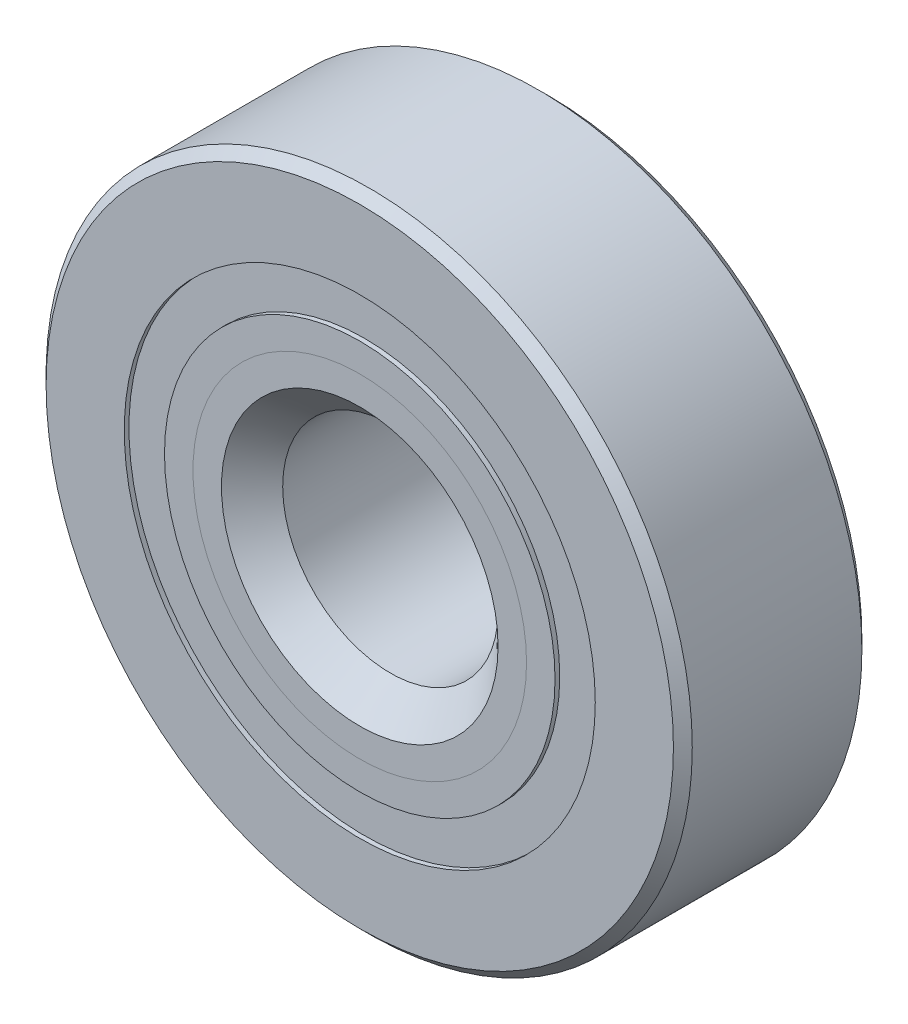
ISO-10303-21;
HEADER;
FILE_DESCRIPTION(('STEP AP214'),'2;1');
FILE_NAME('part.step','',(''),(''),'','','');
FILE_SCHEMA(('AUTOMOTIVE_DESIGN { 1 0 10303 214 1 1 1 1 }'));
ENDSEC;
DATA;
#1=APPLICATION_CONTEXT('core data for automotive mechanical design processes');
#2=APPLICATION_PROTOCOL_DEFINITION('international standard','automotive_design',2000,#1);
#3=PRODUCT_CONTEXT('',#1,'mechanical');
#4=PRODUCT('Part','Part','',(#3));
#5=PRODUCT_RELATED_PRODUCT_CATEGORY('part','',(#4));
#6=PRODUCT_DEFINITION_FORMATION('','',#4);
#7=PRODUCT_DEFINITION_CONTEXT('part definition',#1,'design');
#8=PRODUCT_DEFINITION('design','',#6,#7);
#9=PRODUCT_DEFINITION_SHAPE('','',#8);
#10=(LENGTH_UNIT() NAMED_UNIT(*) SI_UNIT(.MILLI.,.METRE.));
#11=(NAMED_UNIT(*) PLANE_ANGLE_UNIT() SI_UNIT($,.RADIAN.));
#12=(NAMED_UNIT(*) SI_UNIT($,.STERADIAN.) SOLID_ANGLE_UNIT());
#13=UNCERTAINTY_MEASURE_WITH_UNIT(LENGTH_MEASURE(1.E-05),#10,'distance_accuracy_value','');
#14=(GEOMETRIC_REPRESENTATION_CONTEXT(3) GLOBAL_UNCERTAINTY_ASSIGNED_CONTEXT((#13)) GLOBAL_UNIT_ASSIGNED_CONTEXT((#10,
#11,#12)) REPRESENTATION_CONTEXT('',''));
#15=CARTESIAN_POINT('',(0.,0.,0.));
#16=DIRECTION('',(0.,0.,1.));
#17=DIRECTION('',(1.,0.,0.));
#18=AXIS2_PLACEMENT_3D('',#15,#16,#17);
#19=CARTESIAN_POINT('',(0.,6.94313186813187,-1.3697972036192));
#20=DIRECTION('',(0.,0.,-1.));
#21=DIRECTION('',(-1.,0.,0.));
#22=AXIS2_PLACEMENT_3D('',#19,#20,#21);
#23=PLANE('',#22);
#24=CARTESIAN_POINT('',(0.,0.,-1.3697972036192));
#25=DIRECTION('',(0.,0.,1.));
#26=DIRECTION('',(1.,0.,0.));
#27=AXIS2_PLACEMENT_3D('',#24,#25,#26);
#28=CIRCLE('',#27,5.75686813186813);
#29=CARTESIAN_POINT('',(5.75686813186813,0.,-1.3697972036192));
#30=VERTEX_POINT('',#29);
#31=EDGE_CURVE('E11',#30,#30,#28,.T.);
#32=ORIENTED_EDGE('',*,*,#31,.F.);
#33=EDGE_LOOP('',(#32));
#34=FACE_BOUND('',#33,.T.);
#35=CARTESIAN_POINT('',(0.,0.,-1.3697972036192));
#36=DIRECTION('',(0.,0.,1.));
#37=DIRECTION('',(1.,0.,0.));
#38=AXIS2_PLACEMENT_3D('',#35,#36,#37);
#39=CIRCLE('',#38,6.94313186813187);
#40=CARTESIAN_POINT('',(6.94313186813187,0.,-1.3697972036192));
#41=VERTEX_POINT('',#40);
#42=EDGE_CURVE('E58',#41,#41,#39,.T.);
#43=ORIENTED_EDGE('',*,*,#42,.T.);
#44=EDGE_LOOP('',(#43));
#45=FACE_BOUND('',#44,.T.);
#46=ADVANCED_FACE('F44',(#34,#45),#23,.F.);
#47=CARTESIAN_POINT('',(0.,0.,2.778125));
#48=DIRECTION('',(0.,0.,1.));
#49=DIRECTION('',(1.,0.,0.));
#50=AXIS2_PLACEMENT_3D('',#47,#48,#49);
#51=CYLINDRICAL_SURFACE('',#50,5.75686813186813);
#52=CARTESIAN_POINT('',(0.,0.,-2.63921875));
#53=DIRECTION('',(0.,0.,1.));
#54=DIRECTION('',(1.,0.,0.));
#55=AXIS2_PLACEMENT_3D('',#52,#53,#54);
#56=CIRCLE('',#55,5.75686813186813);
#57=CARTESIAN_POINT('',(5.75686813186813,0.,-2.63921875));
#58=VERTEX_POINT('',#57);
#59=EDGE_CURVE('E50',#58,#58,#56,.T.);
#60=ORIENTED_EDGE('',*,*,#59,.F.);
#61=EDGE_LOOP('',(#60));
#62=FACE_BOUND('',#61,.T.);
#63=ORIENTED_EDGE('',*,*,#31,.T.);
#64=EDGE_LOOP('',(#63));
#65=FACE_BOUND('',#64,.T.);
#66=ADVANCED_FACE('F73',(#62,#65),#51,.F.);
#67=CARTESIAN_POINT('',(0.,6.94313186813187,-2.63921875));
#68=DIRECTION('',(0.,0.,1.));
#69=DIRECTION('',(1.,0.,0.));
#70=AXIS2_PLACEMENT_3D('',#67,#68,#69);
#71=PLANE('',#70);
#72=CARTESIAN_POINT('',(0.,0.,-2.63921875));
#73=DIRECTION('',(0.,0.,1.));
#74=DIRECTION('',(1.,0.,0.));
#75=AXIS2_PLACEMENT_3D('',#72,#73,#74);
#76=CIRCLE('',#75,6.94313186813187);
#77=CARTESIAN_POINT('',(6.94313186813187,0.,-2.63921875));
#78=VERTEX_POINT('',#77);
#79=EDGE_CURVE('E54',#78,#78,#76,.T.);
#80=ORIENTED_EDGE('',*,*,#79,.F.);
#81=EDGE_LOOP('',(#80));
#82=FACE_BOUND('',#81,.T.);
#83=ORIENTED_EDGE('',*,*,#59,.T.);
#84=EDGE_LOOP('',(#83));
#85=FACE_BOUND('',#84,.T.);
#86=ADVANCED_FACE('F68',(#82,#85),#71,.F.);
#87=CARTESIAN_POINT('',(0.,0.,2.778125));
#88=DIRECTION('',(0.,0.,1.));
#89=DIRECTION('',(1.,0.,0.));
#90=AXIS2_PLACEMENT_3D('',#87,#88,#89);
#91=CYLINDRICAL_SURFACE('',#90,6.94313186813187);
#92=ORIENTED_EDGE('',*,*,#42,.F.);
#93=EDGE_LOOP('',(#92));
#94=FACE_BOUND('',#93,.T.);
#95=ORIENTED_EDGE('',*,*,#79,.T.);
#96=EDGE_LOOP('',(#95));
#97=FACE_BOUND('',#96,.T.);
#98=ADVANCED_FACE('F65',(#94,#97),#91,.T.);
#99=CLOSED_SHELL('',(#46,#66,#86,#98));
#100=MANIFOLD_SOLID_BREP('B2',#99);
#101=CARTESIAN_POINT('',(0.,6.94313186813187,2.63921875));
#102=DIRECTION('',(0.,0.,-1.));
#103=DIRECTION('',(-1.,0.,0.));
#104=AXIS2_PLACEMENT_3D('',#101,#102,#103);
#105=PLANE('',#104);
#106=CARTESIAN_POINT('',(0.,0.,2.63921875));
#107=DIRECTION('',(0.,0.,1.));
#108=DIRECTION('',(1.,0.,0.));
#109=AXIS2_PLACEMENT_3D('',#106,#107,#108);
#110=CIRCLE('',#109,5.75686813186813);
#111=CARTESIAN_POINT('',(5.75686813186813,0.,2.63921875));
#112=VERTEX_POINT('',#111);
#113=EDGE_CURVE('E43',#112,#112,#110,.T.);
#114=ORIENTED_EDGE('',*,*,#113,.F.);
#115=EDGE_LOOP('',(#114));
#116=FACE_BOUND('',#115,.T.);
#117=CARTESIAN_POINT('',(0.,0.,2.63921875));
#118=DIRECTION('',(0.,0.,1.));
#119=DIRECTION('',(1.,0.,0.));
#120=AXIS2_PLACEMENT_3D('',#117,#118,#119);
#121=CIRCLE('',#120,6.94313186813187);
#122=CARTESIAN_POINT('',(6.94313186813187,0.,2.63921875));
#123=VERTEX_POINT('',#122);
#124=EDGE_CURVE('E126',#123,#123,#121,.T.);
#125=ORIENTED_EDGE('',*,*,#124,.T.);
#126=EDGE_LOOP('',(#125));
#127=FACE_BOUND('',#126,.T.);
#128=ADVANCED_FACE('F112',(#116,#127),#105,.F.);
#129=CARTESIAN_POINT('',(0.,0.,2.778125));
#130=DIRECTION('',(0.,0.,1.));
#131=DIRECTION('',(1.,0.,0.));
#132=AXIS2_PLACEMENT_3D('',#129,#130,#131);
#133=CYLINDRICAL_SURFACE('',#132,5.75686813186813);
#134=CARTESIAN_POINT('',(0.,0.,1.3697972036192));
#135=DIRECTION('',(0.,0.,1.));
#136=DIRECTION('',(1.,0.,0.));
#137=AXIS2_PLACEMENT_3D('',#134,#135,#136);
#138=CIRCLE('',#137,5.75686813186813);
#139=CARTESIAN_POINT('',(5.75686813186813,0.,1.3697972036192));
#140=VERTEX_POINT('',#139);
#141=EDGE_CURVE('E118',#140,#140,#138,.T.);
#142=ORIENTED_EDGE('',*,*,#141,.F.);
#143=EDGE_LOOP('',(#142));
#144=FACE_BOUND('',#143,.T.);
#145=ORIENTED_EDGE('',*,*,#113,.T.);
#146=EDGE_LOOP('',(#145));
#147=FACE_BOUND('',#146,.T.);
#148=ADVANCED_FACE('F141',(#144,#147),#133,.F.);
#149=CARTESIAN_POINT('',(0.,6.94313186813187,1.3697972036192));
#150=DIRECTION('',(0.,0.,1.));
#151=DIRECTION('',(1.,0.,0.));
#152=AXIS2_PLACEMENT_3D('',#149,#150,#151);
#153=PLANE('',#152);
#154=CARTESIAN_POINT('',(0.,0.,1.3697972036192));
#155=DIRECTION('',(0.,0.,1.));
#156=DIRECTION('',(1.,0.,0.));
#157=AXIS2_PLACEMENT_3D('',#154,#155,#156);
#158=CIRCLE('',#157,6.94313186813187);
#159=CARTESIAN_POINT('',(6.94313186813187,0.,1.3697972036192));
#160=VERTEX_POINT('',#159);
#161=EDGE_CURVE('E122',#160,#160,#158,.T.);
#162=ORIENTED_EDGE('',*,*,#161,.F.);
#163=EDGE_LOOP('',(#162));
#164=FACE_BOUND('',#163,.T.);
#165=ORIENTED_EDGE('',*,*,#141,.T.);
#166=EDGE_LOOP('',(#165));
#167=FACE_BOUND('',#166,.T.);
#168=ADVANCED_FACE('F136',(#164,#167),#153,.F.);
#169=CARTESIAN_POINT('',(0.,0.,2.778125));
#170=DIRECTION('',(0.,0.,1.));
#171=DIRECTION('',(1.,0.,0.));
#172=AXIS2_PLACEMENT_3D('',#169,#170,#171);
#173=CYLINDRICAL_SURFACE('',#172,6.94313186813187);
#174=ORIENTED_EDGE('',*,*,#124,.F.);
#175=EDGE_LOOP('',(#174));
#176=FACE_BOUND('',#175,.T.);
#177=ORIENTED_EDGE('',*,*,#161,.T.);
#178=EDGE_LOOP('',(#177));
#179=FACE_BOUND('',#178,.T.);
#180=ADVANCED_FACE('F133',(#176,#179),#173,.T.);
#181=CLOSED_SHELL('',(#128,#148,#168,#180));
#182=MANIFOLD_SOLID_BREP('B6',#181);
#183=CARTESIAN_POINT('',(-3.73243635205714,5.13725791428096,0.));
#184=DIRECTION('',(0.,0.,1.));
#185=DIRECTION('',(-0.587785252292462,0.809016994374955,0.));
#186=AXIS2_PLACEMENT_3D('',#183,#184,#185);
#187=SPHERICAL_SURFACE('',#186,1.3697972036192);
#188=CARTESIAN_POINT('',(-3.73243635205714,5.13725791428096,1.3697972036192));
#189=VERTEX_POINT('',#188);
#190=VERTEX_LOOP('',#189);
#191=FACE_BOUND('',#190,.T.);
#192=ADVANCED_FACE('F180',(#191),#187,.T.);
#193=CLOSED_SHELL('',(#192));
#194=MANIFOLD_SOLID_BREP('B38',#193);
#195=CARTESIAN_POINT('',(-6.0392088784742,1.96225791428098,0.));
#196=DIRECTION('',(0.,0.,1.));
#197=DIRECTION('',(-0.95105651629515,0.309016994374958,0.));
#198=AXIS2_PLACEMENT_3D('',#195,#196,#197);
#199=SPHERICAL_SURFACE('',#198,1.3697972036192);
#200=CARTESIAN_POINT('',(-6.0392088784742,1.96225791428098,1.3697972036192));
#201=VERTEX_POINT('',#200);
#202=VERTEX_LOOP('',#201);
#203=FACE_BOUND('',#202,.T.);
#204=ADVANCED_FACE('F213',(#203),#199,.T.);
#205=CLOSED_SHELL('',(#204));
#206=MANIFOLD_SOLID_BREP('B108',#205);
#207=CARTESIAN_POINT('',(-6.03920887847424,-1.96225791428086,0.));
#208=DIRECTION('',(0.,0.,1.));
#209=DIRECTION('',(-0.951056516295157,-0.309016994374938,0.));
#210=AXIS2_PLACEMENT_3D('',#207,#208,#209);
#211=SPHERICAL_SURFACE('',#210,1.3697972036192);
#212=CARTESIAN_POINT('',(-6.03920887847424,-1.96225791428086,1.3697972036192));
#213=VERTEX_POINT('',#212);
#214=VERTEX_LOOP('',#213);
#215=FACE_BOUND('',#214,.T.);
#216=ADVANCED_FACE('F246',(#215),#211,.T.);
#217=CLOSED_SHELL('',(#216));
#218=MANIFOLD_SOLID_BREP('B176',#217);
#219=CARTESIAN_POINT('',(-3.73243635205725,-5.13725791428088,0.));
#220=DIRECTION('',(0.,0.,1.));
#221=DIRECTION('',(-0.58778525229248,-0.809016994374942,0.));
#222=AXIS2_PLACEMENT_3D('',#219,#220,#221);
#223=SPHERICAL_SURFACE('',#222,1.3697972036192);
#224=CARTESIAN_POINT('',(-3.73243635205725,-5.13725791428088,1.3697972036192));
#225=VERTEX_POINT('',#224);
#226=VERTEX_LOOP('',#225);
#227=FACE_BOUND('',#226,.T.);
#228=ADVANCED_FACE('F279',(#227),#223,.T.);
#229=CLOSED_SHELL('',(#228));
#230=MANIFOLD_SOLID_BREP('B209',#229);
#231=CARTESIAN_POINT('',(0.,-6.35,0.));
#232=DIRECTION('',(0.,0.,1.));
#233=DIRECTION('',(0.,-1.,0.));
#234=AXIS2_PLACEMENT_3D('',#231,#232,#233);
#235=SPHERICAL_SURFACE('',#234,1.3697972036192);
#236=CARTESIAN_POINT('',(0.,-6.35,1.3697972036192));
#237=VERTEX_POINT('',#236);
#238=VERTEX_LOOP('',#237);
#239=FACE_BOUND('',#238,.T.);
#240=ADVANCED_FACE('F312',(#239),#235,.T.);
#241=CLOSED_SHELL('',(#240));
#242=MANIFOLD_SOLID_BREP('B242',#241);
#243=CARTESIAN_POINT('',(3.73243635205718,-5.13725791428094,0.));
#244=DIRECTION('',(0.,0.,1.));
#245=DIRECTION('',(0.587785252292469,-0.809016994374951,0.));
#246=AXIS2_PLACEMENT_3D('',#243,#244,#245);
#247=SPHERICAL_SURFACE('',#246,1.3697972036192);
#248=CARTESIAN_POINT('',(3.73243635205718,-5.13725791428094,1.3697972036192));
#249=VERTEX_POINT('',#248);
#250=VERTEX_LOOP('',#249);
#251=FACE_BOUND('',#250,.T.);
#252=ADVANCED_FACE('F345',(#251),#247,.T.);
#253=CLOSED_SHELL('',(#252));
#254=MANIFOLD_SOLID_BREP('B275',#253);
#255=CARTESIAN_POINT('',(6.03920887847422,-1.96225791428094,0.));
#256=DIRECTION('',(0.,0.,1.));
#257=DIRECTION('',(0.951056516295152,-0.309016994374952,0.));
#258=AXIS2_PLACEMENT_3D('',#255,#256,#257);
#259=SPHERICAL_SURFACE('',#258,1.3697972036192);
#260=CARTESIAN_POINT('',(6.03920887847422,-1.96225791428094,1.3697972036192));
#261=VERTEX_POINT('',#260);
#262=VERTEX_LOOP('',#261);
#263=FACE_BOUND('',#262,.T.);
#264=ADVANCED_FACE('F378',(#263),#259,.T.);
#265=CLOSED_SHELL('',(#264));
#266=MANIFOLD_SOLID_BREP('B308',#265);
#267=CARTESIAN_POINT('',(6.03920887847423,1.9622579142809,0.));
#268=DIRECTION('',(0.,0.,1.));
#269=DIRECTION('',(0.951056516295155,0.309016994374945,0.));
#270=AXIS2_PLACEMENT_3D('',#267,#268,#269);
#271=SPHERICAL_SURFACE('',#270,1.3697972036192);
#272=CARTESIAN_POINT('',(6.03920887847423,1.9622579142809,1.3697972036192));
#273=VERTEX_POINT('',#272);
#274=VERTEX_LOOP('',#273);
#275=FACE_BOUND('',#274,.T.);
#276=ADVANCED_FACE('F411',(#275),#271,.T.);
#277=CLOSED_SHELL('',(#276));
#278=MANIFOLD_SOLID_BREP('B341',#277);
#279=CARTESIAN_POINT('',(3.73243635205721,5.13725791428091,0.));
#280=DIRECTION('',(0.,0.,1.));
#281=DIRECTION('',(0.587785252292474,0.809016994374947,0.));
#282=AXIS2_PLACEMENT_3D('',#279,#280,#281);
#283=SPHERICAL_SURFACE('',#282,1.3697972036192);
#284=CARTESIAN_POINT('',(3.73243635205721,5.13725791428091,1.3697972036192));
#285=VERTEX_POINT('',#284);
#286=VERTEX_LOOP('',#285);
#287=FACE_BOUND('',#286,.T.);
#288=ADVANCED_FACE('F444',(#287),#283,.T.);
#289=CLOSED_SHELL('',(#288));
#290=MANIFOLD_SOLID_BREP('B374',#289);
#291=CARTESIAN_POINT('',(0.,6.35,0.));
#292=DIRECTION('',(0.,0.,1.));
#293=DIRECTION('',(0.,1.,0.));
#294=AXIS2_PLACEMENT_3D('',#291,#292,#293);
#295=SPHERICAL_SURFACE('',#294,1.3697972036192);
#296=CARTESIAN_POINT('',(0.,6.35,1.3697972036192));
#297=VERTEX_POINT('',#296);
#298=VERTEX_LOOP('',#297);
#299=FACE_BOUND('',#298,.T.);
#300=ADVANCED_FACE('F479',(#299),#295,.T.);
#301=CLOSED_SHELL('',(#300));
#302=MANIFOLD_SOLID_BREP('B407',#301);
#303=CARTESIAN_POINT('',(0.,4.91723476502927,2.778125));
#304=DIRECTION('',(0.,0.,-1.));
#305=DIRECTION('',(-1.,0.,0.));
#306=AXIS2_PLACEMENT_3D('',#303,#304,#305);
#307=PLANE('',#306);
#308=CARTESIAN_POINT('',(0.,0.,2.778125));
#309=DIRECTION('',(0.,0.,1.));
#310=DIRECTION('',(1.,0.,0.));
#311=AXIS2_PLACEMENT_3D('',#308,#309,#310);
#312=CIRCLE('',#311,4.0776013981904);
#313=CARTESIAN_POINT('',(4.0776013981904,0.,2.778125));
#314=VERTEX_POINT('',#313);
#315=EDGE_CURVE('E534',#314,#314,#312,.T.);
#316=ORIENTED_EDGE('',*,*,#315,.F.);
#317=EDGE_LOOP('',(#316));
#318=FACE_BOUND('',#317,.T.);
#319=CARTESIAN_POINT('',(0.,0.,2.778125));
#320=DIRECTION('',(0.,0.,1.));
#321=DIRECTION('',(1.,0.,0.));
#322=AXIS2_PLACEMENT_3D('',#319,#320,#321);
#323=CIRCLE('',#322,4.91723476502927);
#324=CARTESIAN_POINT('',(4.91723476502927,0.,2.778125));
#325=VERTEX_POINT('',#324);
#326=EDGE_CURVE('E478',#325,#325,#323,.T.);
#327=ORIENTED_EDGE('',*,*,#326,.T.);
#328=EDGE_LOOP('',(#327));
#329=FACE_BOUND('',#328,.T.);
#330=ADVANCED_FACE('F500',(#318,#329),#307,.F.);
#331=CARTESIAN_POINT('',(0.,0.,1.93849163316114));
#332=DIRECTION('',(0.,0.,1.));
#333=DIRECTION('',(1.,0.,0.));
#334=AXIS2_PLACEMENT_3D('',#331,#332,#333);
#335=CONICAL_SURFACE('',#334,4.0776013981904,0.78539816339745);
#336=ORIENTED_EDGE('',*,*,#326,.F.);
#337=EDGE_LOOP('',(#336));
#338=FACE_BOUND('',#337,.T.);
#339=CARTESIAN_POINT('',(0.,0.,1.93849163316114));
#340=DIRECTION('',(0.,0.,1.));
#341=DIRECTION('',(1.,0.,0.));
#342=AXIS2_PLACEMENT_3D('',#339,#340,#341);
#343=CIRCLE('',#342,4.0776013981904);
#344=CARTESIAN_POINT('',(4.0776013981904,0.,1.93849163316114));
#345=VERTEX_POINT('',#344);
#346=EDGE_CURVE('E506',#345,#345,#343,.T.);
#347=ORIENTED_EDGE('',*,*,#346,.T.);
#348=EDGE_LOOP('',(#347));
#349=FACE_BOUND('',#348,.T.);
#350=ADVANCED_FACE('F541',(#338,#349),#335,.T.);
#351=CARTESIAN_POINT('',(0.,0.,2.778125));
#352=DIRECTION('',(0.,0.,1.));
#353=DIRECTION('',(1.,0.,0.));
#354=AXIS2_PLACEMENT_3D('',#351,#352,#353);
#355=CYLINDRICAL_SURFACE('',#354,4.0776013981904);
#356=ORIENTED_EDGE('',*,*,#346,.F.);
#357=EDGE_LOOP('',(#356));
#358=FACE_BOUND('',#357,.T.);
#359=CARTESIAN_POINT('',(0.,0.,0.));
#360=DIRECTION('',(0.,0.,1.));
#361=DIRECTION('',(1.,0.,0.));
#362=AXIS2_PLACEMENT_3D('',#359,#360,#361);
#363=CIRCLE('',#362,4.0776013981904);
#364=CARTESIAN_POINT('',(4.0776013981904,0.,0.));
#365=VERTEX_POINT('',#364);
#366=EDGE_CURVE('E510',#365,#365,#363,.T.);
#367=ORIENTED_EDGE('',*,*,#366,.T.);
#368=EDGE_LOOP('',(#367));
#369=FACE_BOUND('',#368,.T.);
#370=ADVANCED_FACE('F545',(#358,#369),#355,.T.);
#371=CARTESIAN_POINT('',(0.,4.0776013981904,0.));
#372=DIRECTION('',(0.,0.,-1.));
#373=DIRECTION('',(-1.,0.,0.));
#374=AXIS2_PLACEMENT_3D('',#371,#372,#373);
#375=PLANE('',#374);
#376=ORIENTED_EDGE('',*,*,#366,.F.);
#377=EDGE_LOOP('',(#376));
#378=FACE_BOUND('',#377,.T.);
#379=CARTESIAN_POINT('',(0.,0.,0.));
#380=DIRECTION('',(0.,0.,1.));
#381=DIRECTION('',(1.,0.,0.));
#382=AXIS2_PLACEMENT_3D('',#379,#380,#381);
#383=CIRCLE('',#382,4.9802027963808);
#384=CARTESIAN_POINT('',(4.9802027963808,0.,0.));
#385=VERTEX_POINT('',#384);
#386=EDGE_CURVE('E514',#385,#385,#383,.T.);
#387=ORIENTED_EDGE('',*,*,#386,.T.);
#388=EDGE_LOOP('',(#387));
#389=FACE_BOUND('',#388,.T.);
#390=ADVANCED_FACE('F550',(#378,#389),#375,.F.);
#391=CARTESIAN_POINT('',(0.,0.,0.));
#392=DIRECTION('',(0.,0.,1.));
#393=DIRECTION('',(1.,0.,0.));
#394=AXIS2_PLACEMENT_3D('',#391,#392,#393);
#395=TOROIDAL_SURFACE('',#394,6.35,1.3697972036192);
#396=ORIENTED_EDGE('',*,*,#386,.F.);
#397=EDGE_LOOP('',(#396));
#398=FACE_BOUND('',#397,.T.);
#399=CARTESIAN_POINT('',(0.,0.,-1.23472222222222));
#400=DIRECTION('',(0.,0.,1.));
#401=DIRECTION('',(1.,0.,0.));
#402=AXIS2_PLACEMENT_3D('',#399,#400,#401);
#403=CIRCLE('',#402,5.75686813186813);
#404=CARTESIAN_POINT('',(5.75686813186813,0.,-1.23472222222222));
#405=VERTEX_POINT('',#404);
#406=EDGE_CURVE('E519',#405,#405,#403,.T.);
#407=ORIENTED_EDGE('',*,*,#406,.T.);
#408=EDGE_LOOP('',(#407));
#409=FACE_BOUND('',#408,.T.);
#410=ADVANCED_FACE('F556',(#398,#409),#395,.F.);
#411=CARTESIAN_POINT('',(0.,0.,2.778125));
#412=DIRECTION('',(0.,0.,1.));
#413=DIRECTION('',(1.,0.,0.));
#414=AXIS2_PLACEMENT_3D('',#411,#412,#413);
#415=CYLINDRICAL_SURFACE('',#414,5.75686813186813);
#416=ORIENTED_EDGE('',*,*,#406,.F.);
#417=EDGE_LOOP('',(#416));
#418=FACE_BOUND('',#417,.T.);
#419=CARTESIAN_POINT('',(0.,0.,-2.778125));
#420=DIRECTION('',(0.,0.,1.));
#421=DIRECTION('',(1.,0.,0.));
#422=AXIS2_PLACEMENT_3D('',#419,#420,#421);
#423=CIRCLE('',#422,5.75686813186813);
#424=CARTESIAN_POINT('',(5.75686813186813,0.,-2.778125));
#425=VERTEX_POINT('',#424);
#426=EDGE_CURVE('E522',#425,#425,#423,.T.);
#427=ORIENTED_EDGE('',*,*,#426,.T.);
#428=EDGE_LOOP('',(#427));
#429=FACE_BOUND('',#428,.T.);
#430=ADVANCED_FACE('F560',(#418,#429),#415,.T.);
#431=CARTESIAN_POINT('',(0.,3.4528125,-2.778125));
#432=DIRECTION('',(0.,0.,1.));
#433=DIRECTION('',(1.,0.,0.));
#434=AXIS2_PLACEMENT_3D('',#431,#432,#433);
#435=PLANE('',#434);
#436=ORIENTED_EDGE('',*,*,#426,.F.);
#437=EDGE_LOOP('',(#436));
#438=FACE_BOUND('',#437,.T.);
#439=CARTESIAN_POINT('',(0.,0.,-2.778125));
#440=DIRECTION('',(0.,0.,1.));
#441=DIRECTION('',(1.,0.,0.));
#442=AXIS2_PLACEMENT_3D('',#439,#440,#441);
#443=CIRCLE('',#442,3.4528125);
#444=CARTESIAN_POINT('',(3.4528125,0.,-2.778125));
#445=VERTEX_POINT('',#444);
#446=EDGE_CURVE('E525',#445,#445,#443,.T.);
#447=ORIENTED_EDGE('',*,*,#446,.T.);
#448=EDGE_LOOP('',(#447));
#449=FACE_BOUND('',#448,.T.);
#450=ADVANCED_FACE('F564',(#438,#449),#435,.F.);
#451=CARTESIAN_POINT('',(0.,0.,-2.5003125));
#452=DIRECTION('',(0.,0.,-1.));
#453=DIRECTION('',(-1.,0.,0.));
#454=AXIS2_PLACEMENT_3D('',#451,#452,#453);
#455=CONICAL_SURFACE('',#454,3.175,0.785398163397445);
#456=ORIENTED_EDGE('',*,*,#446,.F.);
#457=EDGE_LOOP('',(#456));
#458=FACE_BOUND('',#457,.T.);
#459=CARTESIAN_POINT('',(0.,0.,-2.5003125));
#460=DIRECTION('',(0.,0.,1.));
#461=DIRECTION('',(1.,0.,0.));
#462=AXIS2_PLACEMENT_3D('',#459,#460,#461);
#463=CIRCLE('',#462,3.175);
#464=CARTESIAN_POINT('',(3.175,0.,-2.5003125));
#465=VERTEX_POINT('',#464);
#466=EDGE_CURVE('E528',#465,#465,#463,.T.);
#467=ORIENTED_EDGE('',*,*,#466,.T.);
#468=EDGE_LOOP('',(#467));
#469=FACE_BOUND('',#468,.T.);
#470=ADVANCED_FACE('F568',(#458,#469),#455,.F.);
#471=CARTESIAN_POINT('',(0.,0.,2.778125));
#472=DIRECTION('',(0.,0.,1.));
#473=DIRECTION('',(1.,0.,0.));
#474=AXIS2_PLACEMENT_3D('',#471,#472,#473);
#475=CYLINDRICAL_SURFACE('',#474,3.175);
#476=ORIENTED_EDGE('',*,*,#466,.F.);
#477=EDGE_LOOP('',(#476));
#478=FACE_BOUND('',#477,.T.);
#479=CARTESIAN_POINT('',(0.,0.,1.8755236018096));
#480=DIRECTION('',(0.,0.,1.));
#481=DIRECTION('',(1.,0.,0.));
#482=AXIS2_PLACEMENT_3D('',#479,#480,#481);
#483=CIRCLE('',#482,3.175);
#484=CARTESIAN_POINT('',(3.175,0.,1.8755236018096));
#485=VERTEX_POINT('',#484);
#486=EDGE_CURVE('E531',#485,#485,#483,.T.);
#487=ORIENTED_EDGE('',*,*,#486,.T.);
#488=EDGE_LOOP('',(#487));
#489=FACE_BOUND('',#488,.T.);
#490=ADVANCED_FACE('F572',(#478,#489),#475,.F.);
#491=CARTESIAN_POINT('',(0.,0.,2.778125));
#492=DIRECTION('',(0.,0.,1.));
#493=DIRECTION('',(1.,0.,0.));
#494=AXIS2_PLACEMENT_3D('',#491,#492,#493);
#495=CONICAL_SURFACE('',#494,4.0776013981904,0.785398163397449);
#496=ORIENTED_EDGE('',*,*,#486,.F.);
#497=EDGE_LOOP('',(#496));
#498=FACE_BOUND('',#497,.T.);
#499=ORIENTED_EDGE('',*,*,#315,.T.);
#500=EDGE_LOOP('',(#499));
#501=FACE_BOUND('',#500,.T.);
#502=ADVANCED_FACE('F538',(#498,#501),#495,.F.);
#503=CLOSED_SHELL('',(#330,#350,#370,#390,#410,#430,#450,#470,#490,#502));
#504=MANIFOLD_SOLID_BREP('B440',#503);
#505=CARTESIAN_POINT('',(0.,5.75686813186813,2.778125));
#506=DIRECTION('',(0.,0.,-1.));
#507=DIRECTION('',(-1.,0.,0.));
#508=AXIS2_PLACEMENT_3D('',#505,#506,#507);
#509=PLANE('',#508);
#510=CARTESIAN_POINT('',(0.,0.,2.778125));
#511=DIRECTION('',(0.,0.,1.));
#512=DIRECTION('',(1.,0.,0.));
#513=AXIS2_PLACEMENT_3D('',#510,#511,#512);
#514=CIRCLE('',#513,4.91723476502927);
#515=CARTESIAN_POINT('',(4.91723476502927,0.,2.778125));
#516=VERTEX_POINT('',#515);
#517=EDGE_CURVE('E499',#516,#516,#514,.T.);
#518=ORIENTED_EDGE('',*,*,#517,.F.);
#519=EDGE_LOOP('',(#518));
#520=FACE_BOUND('',#519,.T.);
#521=CARTESIAN_POINT('',(0.,0.,2.778125));
#522=DIRECTION('',(0.,0.,1.));
#523=DIRECTION('',(1.,0.,0.));
#524=AXIS2_PLACEMENT_3D('',#521,#522,#523);
#525=CIRCLE('',#524,5.75686813186813);
#526=CARTESIAN_POINT('',(5.75686813186813,0.,2.778125));
#527=VERTEX_POINT('',#526);
#528=EDGE_CURVE('E681',#527,#527,#525,.T.);
#529=ORIENTED_EDGE('',*,*,#528,.T.);
#530=EDGE_LOOP('',(#529));
#531=FACE_BOUND('',#530,.T.);
#532=ADVANCED_FACE('F659',(#520,#531),#509,.F.);
#533=CARTESIAN_POINT('',(0.,0.,2.778125));
#534=DIRECTION('',(0.,0.,1.));
#535=DIRECTION('',(1.,0.,0.));
#536=AXIS2_PLACEMENT_3D('',#533,#534,#535);
#537=CONICAL_SURFACE('',#536,4.91723476502927,0.78539816339745);
#538=CARTESIAN_POINT('',(0.,0.,1.93849163316114));
#539=DIRECTION('',(0.,0.,1.));
#540=DIRECTION('',(1.,0.,0.));
#541=AXIS2_PLACEMENT_3D('',#538,#539,#540);
#542=CIRCLE('',#541,4.0776013981904);
#543=CARTESIAN_POINT('',(4.0776013981904,0.,1.93849163316114));
#544=VERTEX_POINT('',#543);
#545=EDGE_CURVE('E665',#544,#544,#542,.T.);
#546=ORIENTED_EDGE('',*,*,#545,.F.);
#547=EDGE_LOOP('',(#546));
#548=FACE_BOUND('',#547,.T.);
#549=ORIENTED_EDGE('',*,*,#517,.T.);
#550=EDGE_LOOP('',(#549));
#551=FACE_BOUND('',#550,.T.);
#552=ADVANCED_FACE('F706',(#548,#551),#537,.F.);
#553=CARTESIAN_POINT('',(0.,0.,2.778125));
#554=DIRECTION('',(0.,0.,1.));
#555=DIRECTION('',(1.,0.,0.));
#556=AXIS2_PLACEMENT_3D('',#553,#554,#555);
#557=CYLINDRICAL_SURFACE('',#556,4.0776013981904);
#558=CARTESIAN_POINT('',(0.,0.,0.));
#559=DIRECTION('',(0.,0.,1.));
#560=DIRECTION('',(1.,0.,0.));
#561=AXIS2_PLACEMENT_3D('',#558,#559,#560);
#562=CIRCLE('',#561,4.0776013981904);
#563=CARTESIAN_POINT('',(4.0776013981904,0.,0.));
#564=VERTEX_POINT('',#563);
#565=EDGE_CURVE('E669',#564,#564,#562,.T.);
#566=ORIENTED_EDGE('',*,*,#565,.F.);
#567=EDGE_LOOP('',(#566));
#568=FACE_BOUND('',#567,.T.);
#569=ORIENTED_EDGE('',*,*,#545,.T.);
#570=EDGE_LOOP('',(#569));
#571=FACE_BOUND('',#570,.T.);
#572=ADVANCED_FACE('F701',(#568,#571),#557,.F.);
#573=CARTESIAN_POINT('',(0.,4.0776013981904,0.));
#574=DIRECTION('',(0.,0.,1.));
#575=DIRECTION('',(1.,0.,0.));
#576=AXIS2_PLACEMENT_3D('',#573,#574,#575);
#577=PLANE('',#576);
#578=CARTESIAN_POINT('',(0.,0.,0.));
#579=DIRECTION('',(0.,0.,1.));
#580=DIRECTION('',(1.,0.,0.));
#581=AXIS2_PLACEMENT_3D('',#578,#579,#580);
#582=CIRCLE('',#581,4.9802027963808);
#583=CARTESIAN_POINT('',(4.9802027963808,0.,0.));
#584=VERTEX_POINT('',#583);
#585=EDGE_CURVE('E673',#584,#584,#582,.T.);
#586=ORIENTED_EDGE('',*,*,#585,.F.);
#587=EDGE_LOOP('',(#586));
#588=FACE_BOUND('',#587,.T.);
#589=ORIENTED_EDGE('',*,*,#565,.T.);
#590=EDGE_LOOP('',(#589));
#591=FACE_BOUND('',#590,.T.);
#592=ADVANCED_FACE('F695',(#588,#591),#577,.F.);
#593=CARTESIAN_POINT('',(0.,0.,0.));
#594=DIRECTION('',(0.,0.,1.));
#595=DIRECTION('',(1.,0.,0.));
#596=AXIS2_PLACEMENT_3D('',#593,#594,#595);
#597=TOROIDAL_SURFACE('',#596,6.35,1.3697972036192);
#598=CARTESIAN_POINT('',(0.,0.,1.23472222222222));
#599=DIRECTION('',(0.,0.,1.));
#600=DIRECTION('',(1.,0.,0.));
#601=AXIS2_PLACEMENT_3D('',#598,#599,#600);
#602=CIRCLE('',#601,5.75686813186813);
#603=CARTESIAN_POINT('',(5.75686813186813,0.,1.23472222222222));
#604=VERTEX_POINT('',#603);
#605=EDGE_CURVE('E678',#604,#604,#602,.T.);
#606=ORIENTED_EDGE('',*,*,#605,.F.);
#607=EDGE_LOOP('',(#606));
#608=FACE_BOUND('',#607,.T.);
#609=ORIENTED_EDGE('',*,*,#585,.T.);
#610=EDGE_LOOP('',(#609));
#611=FACE_BOUND('',#610,.T.);
#612=ADVANCED_FACE('F689',(#608,#611),#597,.F.);
#613=CARTESIAN_POINT('',(0.,0.,2.778125));
#614=DIRECTION('',(0.,0.,1.));
#615=DIRECTION('',(1.,0.,0.));
#616=AXIS2_PLACEMENT_3D('',#613,#614,#615);
#617=CYLINDRICAL_SURFACE('',#616,5.75686813186813);
#618=ORIENTED_EDGE('',*,*,#528,.F.);
#619=EDGE_LOOP('',(#618));
#620=FACE_BOUND('',#619,.T.);
#621=ORIENTED_EDGE('',*,*,#605,.T.);
#622=EDGE_LOOP('',(#621));
#623=FACE_BOUND('',#622,.T.);
#624=ADVANCED_FACE('F686',(#620,#623),#617,.T.);
#625=CLOSED_SHELL('',(#532,#552,#572,#592,#612,#624));
#626=MANIFOLD_SOLID_BREP('B473',#625);
#627=CARTESIAN_POINT('',(0.,0.,2.5003125));
#628=DIRECTION('',(0.,0.,-1.));
#629=DIRECTION('',(-1.,0.,0.));
#630=AXIS2_PLACEMENT_3D('',#627,#628,#629);
#631=CONICAL_SURFACE('',#630,9.525,0.785398163397446);
#632=CARTESIAN_POINT('',(0.,0.,2.778125));
#633=DIRECTION('',(0.,0.,1.));
#634=DIRECTION('',(1.,0.,0.));
#635=AXIS2_PLACEMENT_3D('',#632,#633,#634);
#636=CIRCLE('',#635,9.2471875);
#637=CARTESIAN_POINT('',(9.2471875,0.,2.778125));
#638=VERTEX_POINT('',#637);
#639=EDGE_CURVE('E779',#638,#638,#636,.T.);
#640=ORIENTED_EDGE('',*,*,#639,.F.);
#641=EDGE_LOOP('',(#640));
#642=FACE_BOUND('',#641,.T.);
#643=CARTESIAN_POINT('',(0.,0.,2.5003125));
#644=DIRECTION('',(0.,0.,1.));
#645=DIRECTION('',(1.,0.,0.));
#646=AXIS2_PLACEMENT_3D('',#643,#644,#645);
#647=CIRCLE('',#646,9.525);
#648=CARTESIAN_POINT('',(9.525,0.,2.5003125));
#649=VERTEX_POINT('',#648);
#650=EDGE_CURVE('E658',#649,#649,#647,.T.);
#651=ORIENTED_EDGE('',*,*,#650,.T.);
#652=EDGE_LOOP('',(#651));
#653=FACE_BOUND('',#652,.T.);
#654=ADVANCED_FACE('F751',(#642,#653),#631,.T.);
#655=CARTESIAN_POINT('',(0.,0.,2.778125));
#656=DIRECTION('',(0.,0.,1.));
#657=DIRECTION('',(1.,0.,0.));
#658=AXIS2_PLACEMENT_3D('',#655,#656,#657);
#659=CYLINDRICAL_SURFACE('',#658,9.525);
#660=ORIENTED_EDGE('',*,*,#650,.F.);
#661=EDGE_LOOP('',(#660));
#662=FACE_BOUND('',#661,.T.);
#663=CARTESIAN_POINT('',(0.,0.,-2.5003125));
#664=DIRECTION('',(0.,0.,1.));
#665=DIRECTION('',(1.,0.,0.));
#666=AXIS2_PLACEMENT_3D('',#663,#664,#665);
#667=CIRCLE('',#666,9.525);
#668=CARTESIAN_POINT('',(9.525,0.,-2.5003125));
#669=VERTEX_POINT('',#668);
#670=EDGE_CURVE('E757',#669,#669,#667,.T.);
#671=ORIENTED_EDGE('',*,*,#670,.T.);
#672=EDGE_LOOP('',(#671));
#673=FACE_BOUND('',#672,.T.);
#674=ADVANCED_FACE('F786',(#662,#673),#659,.T.);
#675=CARTESIAN_POINT('',(0.,0.,-2.778125));
#676=DIRECTION('',(0.,0.,1.));
#677=DIRECTION('',(1.,0.,0.));
#678=AXIS2_PLACEMENT_3D('',#675,#676,#677);
#679=CONICAL_SURFACE('',#678,9.2471875,0.785398163397445);
#680=ORIENTED_EDGE('',*,*,#670,.F.);
#681=EDGE_LOOP('',(#680));
#682=FACE_BOUND('',#681,.T.);
#683=CARTESIAN_POINT('',(0.,0.,-2.778125));
#684=DIRECTION('',(0.,0.,1.));
#685=DIRECTION('',(1.,0.,0.));
#686=AXIS2_PLACEMENT_3D('',#683,#684,#685);
#687=CIRCLE('',#686,9.2471875);
#688=CARTESIAN_POINT('',(9.2471875,0.,-2.778125));
#689=VERTEX_POINT('',#688);
#690=EDGE_CURVE('E761',#689,#689,#687,.T.);
#691=ORIENTED_EDGE('',*,*,#690,.T.);
#692=EDGE_LOOP('',(#691));
#693=FACE_BOUND('',#692,.T.);
#694=ADVANCED_FACE('F790',(#682,#693),#679,.T.);
#695=CARTESIAN_POINT('',(0.,9.2471875,-2.778125));
#696=DIRECTION('',(0.,0.,1.));
#697=DIRECTION('',(1.,0.,0.));
#698=AXIS2_PLACEMENT_3D('',#695,#696,#697);
#699=PLANE('',#698);
#700=ORIENTED_EDGE('',*,*,#690,.F.);
#701=EDGE_LOOP('',(#700));
#702=FACE_BOUND('',#701,.T.);
#703=CARTESIAN_POINT('',(0.,0.,-2.778125));
#704=DIRECTION('',(0.,0.,1.));
#705=DIRECTION('',(1.,0.,0.));
#706=AXIS2_PLACEMENT_3D('',#703,#704,#705);
#707=CIRCLE('',#706,6.94313186813187);
#708=CARTESIAN_POINT('',(6.94313186813187,0.,-2.778125));
#709=VERTEX_POINT('',#708);
#710=EDGE_CURVE('E765',#709,#709,#707,.T.);
#711=ORIENTED_EDGE('',*,*,#710,.T.);
#712=EDGE_LOOP('',(#711));
#713=FACE_BOUND('',#712,.T.);
#714=ADVANCED_FACE('F795',(#702,#713),#699,.F.);
#715=CARTESIAN_POINT('',(0.,0.,2.778125));
#716=DIRECTION('',(0.,0.,1.));
#717=DIRECTION('',(1.,0.,0.));
#718=AXIS2_PLACEMENT_3D('',#715,#716,#717);
#719=CYLINDRICAL_SURFACE('',#718,6.94313186813187);
#720=ORIENTED_EDGE('',*,*,#710,.F.);
#721=EDGE_LOOP('',(#720));
#722=FACE_BOUND('',#721,.T.);
#723=CARTESIAN_POINT('',(0.,0.,-1.23472222222222));
#724=DIRECTION('',(0.,0.,1.));
#725=DIRECTION('',(1.,0.,0.));
#726=AXIS2_PLACEMENT_3D('',#723,#724,#725);
#727=CIRCLE('',#726,6.94313186813187);
#728=CARTESIAN_POINT('',(6.94313186813187,0.,-1.23472222222222));
#729=VERTEX_POINT('',#728);
#730=EDGE_CURVE('E770',#729,#729,#727,.T.);
#731=ORIENTED_EDGE('',*,*,#730,.T.);
#732=EDGE_LOOP('',(#731));
#733=FACE_BOUND('',#732,.T.);
#734=ADVANCED_FACE('F801',(#722,#733),#719,.F.);
#735=CARTESIAN_POINT('',(0.,0.,0.));
#736=DIRECTION('',(0.,0.,1.));
#737=DIRECTION('',(1.,0.,0.));
#738=AXIS2_PLACEMENT_3D('',#735,#736,#737);
#739=TOROIDAL_SURFACE('',#738,6.35,1.3697972036192);
#740=ORIENTED_EDGE('',*,*,#730,.F.);
#741=EDGE_LOOP('',(#740));
#742=FACE_BOUND('',#741,.T.);
#743=CARTESIAN_POINT('',(0.,0.,1.23472222222222));
#744=DIRECTION('',(0.,0.,1.));
#745=DIRECTION('',(1.,0.,0.));
#746=AXIS2_PLACEMENT_3D('',#743,#744,#745);
#747=CIRCLE('',#746,6.94313186813187);
#748=CARTESIAN_POINT('',(6.94313186813187,0.,1.23472222222222));
#749=VERTEX_POINT('',#748);
#750=EDGE_CURVE('E773',#749,#749,#747,.T.);
#751=ORIENTED_EDGE('',*,*,#750,.T.);
#752=EDGE_LOOP('',(#751));
#753=FACE_BOUND('',#752,.T.);
#754=ADVANCED_FACE('F805',(#742,#753),#739,.F.);
#755=CARTESIAN_POINT('',(0.,0.,2.778125));
#756=DIRECTION('',(0.,0.,1.));
#757=DIRECTION('',(1.,0.,0.));
#758=AXIS2_PLACEMENT_3D('',#755,#756,#757);
#759=CYLINDRICAL_SURFACE('',#758,6.94313186813187);
#760=ORIENTED_EDGE('',*,*,#750,.F.);
#761=EDGE_LOOP('',(#760));
#762=FACE_BOUND('',#761,.T.);
#763=CARTESIAN_POINT('',(0.,0.,2.778125));
#764=DIRECTION('',(0.,0.,1.));
#765=DIRECTION('',(1.,0.,0.));
#766=AXIS2_PLACEMENT_3D('',#763,#764,#765);
#767=CIRCLE('',#766,6.94313186813187);
#768=CARTESIAN_POINT('',(6.94313186813187,0.,2.778125));
#769=VERTEX_POINT('',#768);
#770=EDGE_CURVE('E776',#769,#769,#767,.T.);
#771=ORIENTED_EDGE('',*,*,#770,.T.);
#772=EDGE_LOOP('',(#771));
#773=FACE_BOUND('',#772,.T.);
#774=ADVANCED_FACE('F809',(#762,#773),#759,.F.);
#775=CARTESIAN_POINT('',(0.,9.2471875,2.778125));
#776=DIRECTION('',(0.,0.,-1.));
#777=DIRECTION('',(-1.,0.,0.));
#778=AXIS2_PLACEMENT_3D('',#775,#776,#777);
#779=PLANE('',#778);
#780=ORIENTED_EDGE('',*,*,#770,.F.);
#781=EDGE_LOOP('',(#780));
#782=FACE_BOUND('',#781,.T.);
#783=ORIENTED_EDGE('',*,*,#639,.T.);
#784=EDGE_LOOP('',(#783));
#785=FACE_BOUND('',#784,.T.);
#786=ADVANCED_FACE('F783',(#782,#785),#779,.F.);
#787=CLOSED_SHELL('',(#654,#674,#694,#714,#734,#754,#774,#786));
#788=MANIFOLD_SOLID_BREP('B494',#787);
#789=ADVANCED_BREP_SHAPE_REPRESENTATION('',(#18,#100,#182,#194,#206,#218,#230,#242,#254,#266,
#278,#290,#302,#504,#626,#788),#14);
#790=SHAPE_DEFINITION_REPRESENTATION(#9,#789);
ENDSEC;
END-ISO-10303-21;
